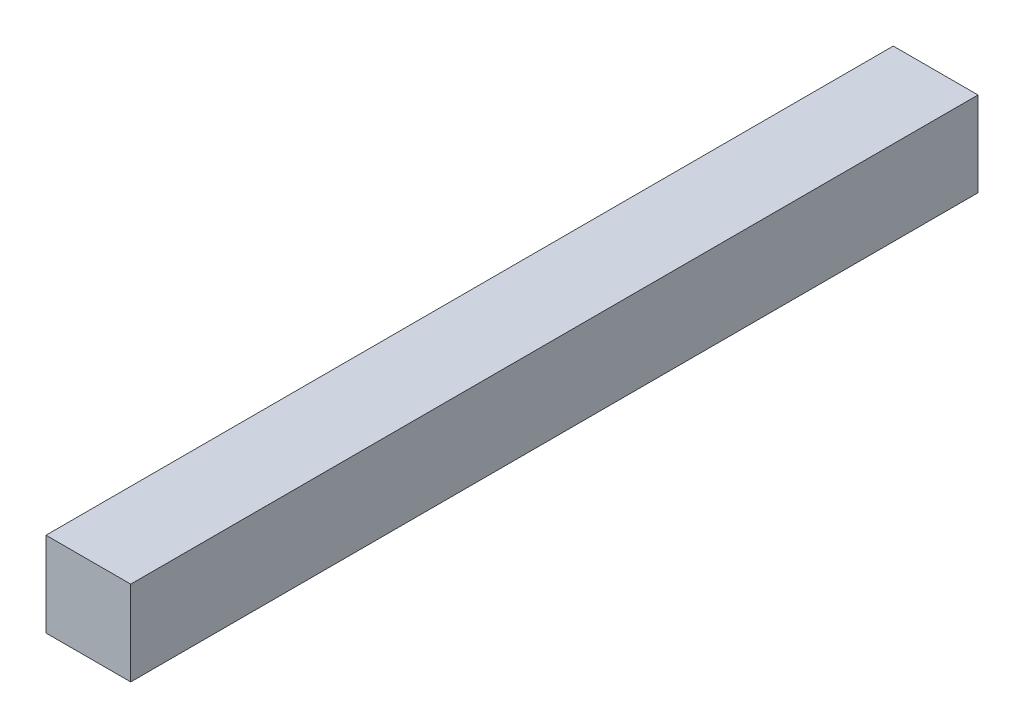
ISO-10303-21;
HEADER;
FILE_DESCRIPTION(('STEP AP214'),'2;1');
FILE_NAME('part.step','',(''),(''),'','','');
FILE_SCHEMA(('AUTOMOTIVE_DESIGN { 1 0 10303 214 1 1 1 1 }'));
ENDSEC;
DATA;
#1=APPLICATION_CONTEXT('core data for automotive mechanical design processes');
#2=APPLICATION_PROTOCOL_DEFINITION('international standard','automotive_design',2000,#1);
#3=PRODUCT_CONTEXT('',#1,'mechanical');
#4=PRODUCT('Part','Part','',(#3));
#5=PRODUCT_RELATED_PRODUCT_CATEGORY('part','',(#4));
#6=PRODUCT_DEFINITION_FORMATION('','',#4);
#7=PRODUCT_DEFINITION_CONTEXT('part definition',#1,'design');
#8=PRODUCT_DEFINITION('design','',#6,#7);
#9=PRODUCT_DEFINITION_SHAPE('','',#8);
#10=(LENGTH_UNIT() NAMED_UNIT(*) SI_UNIT(.MILLI.,.METRE.));
#11=(NAMED_UNIT(*) PLANE_ANGLE_UNIT() SI_UNIT($,.RADIAN.));
#12=(NAMED_UNIT(*) SI_UNIT($,.STERADIAN.) SOLID_ANGLE_UNIT());
#13=UNCERTAINTY_MEASURE_WITH_UNIT(LENGTH_MEASURE(1.E-05),#10,'distance_accuracy_value','');
#14=(GEOMETRIC_REPRESENTATION_CONTEXT(3) GLOBAL_UNCERTAINTY_ASSIGNED_CONTEXT((#13)) GLOBAL_UNIT_ASSIGNED_CONTEXT((#10,
#11,#12)) REPRESENTATION_CONTEXT('',''));
#15=CARTESIAN_POINT('',(0.,0.,0.));
#16=DIRECTION('',(0.,0.,1.));
#17=DIRECTION('',(1.,0.,0.));
#18=AXIS2_PLACEMENT_3D('',#15,#16,#17);
#19=CARTESIAN_POINT('',(0.,0.,-254.));
#20=DIRECTION('',(-1.,0.,0.));
#21=DIRECTION('',(0.,0.,1.));
#22=AXIS2_PLACEMENT_3D('',#19,#20,#21);
#23=PLANE('',#22);
#24=DIRECTION('',(0.,-1.,0.));
#25=VECTOR('',#24,1.);
#26=CARTESIAN_POINT('',(0.,0.,0.));
#27=LINE('',#26,#25);
#28=CARTESIAN_POINT('',(0.,25.4,0.));
#29=VERTEX_POINT('',#28);
#30=CARTESIAN_POINT('',(0.,0.,0.));
#31=VERTEX_POINT('',#30);
#32=EDGE_CURVE('E101',#29,#31,#27,.T.);
#33=ORIENTED_EDGE('',*,*,#32,.F.);
#34=DIRECTION('',(0.,0.,1.));
#35=VECTOR('',#34,1.);
#36=CARTESIAN_POINT('',(0.,25.4,-254.));
#37=LINE('',#36,#35);
#38=CARTESIAN_POINT('',(0.,25.4,-254.));
#39=VERTEX_POINT('',#38);
#40=EDGE_CURVE('E11',#39,#29,#37,.T.);
#41=ORIENTED_EDGE('',*,*,#40,.F.);
#42=DIRECTION('',(0.,-1.,0.));
#43=VECTOR('',#42,1.);
#44=CARTESIAN_POINT('',(0.,0.,-254.));
#45=LINE('',#44,#43);
#46=CARTESIAN_POINT('',(0.,0.,-254.));
#47=VERTEX_POINT('',#46);
#48=EDGE_CURVE('E95',#39,#47,#45,.T.);
#49=ORIENTED_EDGE('',*,*,#48,.T.);
#50=DIRECTION('',(0.,0.,1.));
#51=VECTOR('',#50,1.);
#52=CARTESIAN_POINT('',(0.,0.,-254.));
#53=LINE('',#52,#51);
#54=EDGE_CURVE('E40',#47,#31,#53,.T.);
#55=ORIENTED_EDGE('',*,*,#54,.T.);
#56=EDGE_LOOP('',(#33,#41,#49,#55));
#57=FACE_BOUND('',#56,.T.);
#58=ADVANCED_FACE('F37',(#57),#23,.T.);
#59=CARTESIAN_POINT('',(0.,25.4,-254.));
#60=DIRECTION('',(0.,1.,0.));
#61=DIRECTION('',(0.,0.,1.));
#62=AXIS2_PLACEMENT_3D('',#59,#60,#61);
#63=PLANE('',#62);
#64=DIRECTION('',(-1.,0.,0.));
#65=VECTOR('',#64,1.);
#66=CARTESIAN_POINT('',(0.,25.4,0.));
#67=LINE('',#66,#65);
#68=CARTESIAN_POINT('',(25.4,25.4,0.));
#69=VERTEX_POINT('',#68);
#70=EDGE_CURVE('E97',#69,#29,#67,.T.);
#71=ORIENTED_EDGE('',*,*,#70,.F.);
#72=DIRECTION('',(0.,0.,1.));
#73=VECTOR('',#72,1.);
#74=CARTESIAN_POINT('',(25.4,25.4,-254.));
#75=LINE('',#74,#73);
#76=CARTESIAN_POINT('',(25.4,25.4,-254.));
#77=VERTEX_POINT('',#76);
#78=EDGE_CURVE('E46',#77,#69,#75,.T.);
#79=ORIENTED_EDGE('',*,*,#78,.F.);
#80=DIRECTION('',(-1.,0.,0.));
#81=VECTOR('',#80,1.);
#82=CARTESIAN_POINT('',(0.,25.4,-254.));
#83=LINE('',#82,#81);
#84=EDGE_CURVE('E92',#77,#39,#83,.T.);
#85=ORIENTED_EDGE('',*,*,#84,.T.);
#86=ORIENTED_EDGE('',*,*,#40,.T.);
#87=EDGE_LOOP('',(#71,#79,#85,#86));
#88=FACE_BOUND('',#87,.T.);
#89=ADVANCED_FACE('F111',(#88),#63,.T.);
#90=CARTESIAN_POINT('',(25.4,0.,-254.));
#91=DIRECTION('',(1.,0.,0.));
#92=DIRECTION('',(0.,0.,-1.));
#93=AXIS2_PLACEMENT_3D('',#90,#91,#92);
#94=PLANE('',#93);
#95=DIRECTION('',(0.,1.,0.));
#96=VECTOR('',#95,1.);
#97=CARTESIAN_POINT('',(25.4,0.,0.));
#98=LINE('',#97,#96);
#99=CARTESIAN_POINT('',(25.4,0.,0.));
#100=VERTEX_POINT('',#99);
#101=EDGE_CURVE('E87',#100,#69,#98,.T.);
#102=ORIENTED_EDGE('',*,*,#101,.F.);
#103=DIRECTION('',(0.,0.,1.));
#104=VECTOR('',#103,1.);
#105=CARTESIAN_POINT('',(25.4,0.,-254.));
#106=LINE('',#105,#104);
#107=CARTESIAN_POINT('',(25.4,0.,-254.));
#108=VERTEX_POINT('',#107);
#109=EDGE_CURVE('E82',#108,#100,#106,.T.);
#110=ORIENTED_EDGE('',*,*,#109,.F.);
#111=DIRECTION('',(0.,1.,0.));
#112=VECTOR('',#111,1.);
#113=CARTESIAN_POINT('',(25.4,0.,-254.));
#114=LINE('',#113,#112);
#115=EDGE_CURVE('E85',#108,#77,#114,.T.);
#116=ORIENTED_EDGE('',*,*,#115,.T.);
#117=ORIENTED_EDGE('',*,*,#78,.T.);
#118=EDGE_LOOP('',(#102,#110,#116,#117));
#119=FACE_BOUND('',#118,.T.);
#120=ADVANCED_FACE('F84',(#119),#94,.T.);
#121=CARTESIAN_POINT('',(0.,0.,-254.));
#122=DIRECTION('',(0.,-1.,0.));
#123=DIRECTION('',(0.,0.,-1.));
#124=AXIS2_PLACEMENT_3D('',#121,#122,#123);
#125=PLANE('',#124);
#126=DIRECTION('',(1.,0.,0.));
#127=VECTOR('',#126,1.);
#128=CARTESIAN_POINT('',(0.,0.,0.));
#129=LINE('',#128,#127);
#130=EDGE_CURVE('E104',#31,#100,#129,.T.);
#131=ORIENTED_EDGE('',*,*,#130,.F.);
#132=ORIENTED_EDGE('',*,*,#54,.F.);
#133=DIRECTION('',(1.,0.,0.));
#134=VECTOR('',#133,1.);
#135=CARTESIAN_POINT('',(0.,0.,-254.));
#136=LINE('',#135,#134);
#137=EDGE_CURVE('E91',#47,#108,#136,.T.);
#138=ORIENTED_EDGE('',*,*,#137,.T.);
#139=ORIENTED_EDGE('',*,*,#109,.T.);
#140=EDGE_LOOP('',(#131,#132,#138,#139));
#141=FACE_BOUND('',#140,.T.);
#142=ADVANCED_FACE('F94',(#141),#125,.T.);
#143=CARTESIAN_POINT('',(0.,25.4,-254.));
#144=DIRECTION('',(0.,0.,-1.));
#145=DIRECTION('',(-1.,0.,0.));
#146=AXIS2_PLACEMENT_3D('',#143,#144,#145);
#147=PLANE('',#146);
#148=ORIENTED_EDGE('',*,*,#48,.F.);
#149=ORIENTED_EDGE('',*,*,#84,.F.);
#150=ORIENTED_EDGE('',*,*,#115,.F.);
#151=ORIENTED_EDGE('',*,*,#137,.F.);
#152=EDGE_LOOP('',(#148,#149,#150,#151));
#153=FACE_BOUND('',#152,.T.);
#154=ADVANCED_FACE('F90',(#153),#147,.T.);
#155=CARTESIAN_POINT('',(0.,25.4,0.));
#156=DIRECTION('',(0.,0.,-1.));
#157=DIRECTION('',(-1.,0.,0.));
#158=AXIS2_PLACEMENT_3D('',#155,#156,#157);
#159=PLANE('',#158);
#160=ORIENTED_EDGE('',*,*,#32,.T.);
#161=ORIENTED_EDGE('',*,*,#130,.T.);
#162=ORIENTED_EDGE('',*,*,#101,.T.);
#163=ORIENTED_EDGE('',*,*,#70,.T.);
#164=EDGE_LOOP('',(#160,#161,#162,#163));
#165=FACE_BOUND('',#164,.T.);
#166=ADVANCED_FACE('F110',(#165),#159,.F.);
#167=CLOSED_SHELL('',(#58,#89,#120,#142,#154,#166));
#168=MANIFOLD_SOLID_BREP('B2',#167);
#169=ADVANCED_BREP_SHAPE_REPRESENTATION('',(#18,#168),#14);
#170=SHAPE_DEFINITION_REPRESENTATION(#9,#169);
ENDSEC;
END-ISO-10303-21;
